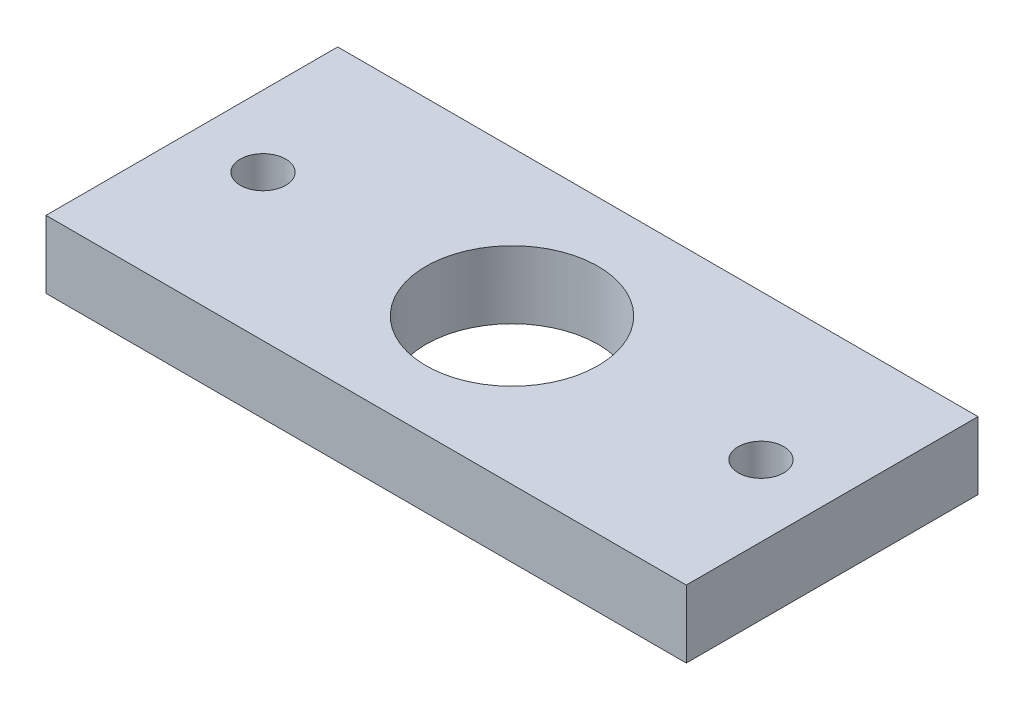
ISO-10303-21;
HEADER;
FILE_DESCRIPTION(('STEP AP214'),'2;1');
FILE_NAME('part.step','',(''),(''),'','','');
FILE_SCHEMA(('AUTOMOTIVE_DESIGN { 1 0 10303 214 1 1 1 1 }'));
ENDSEC;
DATA;
#1=APPLICATION_CONTEXT('core data for automotive mechanical design processes');
#2=APPLICATION_PROTOCOL_DEFINITION('international standard','automotive_design',2000,#1);
#3=PRODUCT_CONTEXT('',#1,'mechanical');
#4=PRODUCT('Part','Part','',(#3));
#5=PRODUCT_RELATED_PRODUCT_CATEGORY('part','',(#4));
#6=PRODUCT_DEFINITION_FORMATION('','',#4);
#7=PRODUCT_DEFINITION_CONTEXT('part definition',#1,'design');
#8=PRODUCT_DEFINITION('design','',#6,#7);
#9=PRODUCT_DEFINITION_SHAPE('','',#8);
#10=(LENGTH_UNIT() NAMED_UNIT(*) SI_UNIT(.MILLI.,.METRE.));
#11=(NAMED_UNIT(*) PLANE_ANGLE_UNIT() SI_UNIT($,.RADIAN.));
#12=(NAMED_UNIT(*) SI_UNIT($,.STERADIAN.) SOLID_ANGLE_UNIT());
#13=UNCERTAINTY_MEASURE_WITH_UNIT(LENGTH_MEASURE(1.E-05),#10,'distance_accuracy_value','');
#14=(GEOMETRIC_REPRESENTATION_CONTEXT(3) GLOBAL_UNCERTAINTY_ASSIGNED_CONTEXT((#13)) GLOBAL_UNIT_ASSIGNED_CONTEXT((#10,
#11,#12)) REPRESENTATION_CONTEXT('',''));
#15=CARTESIAN_POINT('',(0.,0.,0.));
#16=DIRECTION('',(0.,0.,1.));
#17=DIRECTION('',(1.,0.,0.));
#18=AXIS2_PLACEMENT_3D('',#15,#16,#17);
#19=CARTESIAN_POINT('',(0.,-2.375,0.));
#20=DIRECTION('',(0.,1.,0.));
#21=DIRECTION('',(1.,0.,0.));
#22=AXIS2_PLACEMENT_3D('',#19,#20,#21);
#23=PLANE('',#22);
#24=DIRECTION('',(-1.,0.,0.));
#25=VECTOR('',#24,1.);
#26=CARTESIAN_POINT('',(22.5,-2.375,-10.25));
#27=LINE('',#26,#25);
#28=CARTESIAN_POINT('',(22.5,-2.375,-10.25));
#29=VERTEX_POINT('',#28);
#30=CARTESIAN_POINT('',(-22.5,-2.375,-10.25));
#31=VERTEX_POINT('',#30);
#32=EDGE_CURVE('E80',#29,#31,#27,.T.);
#33=ORIENTED_EDGE('',*,*,#32,.F.);
#34=DIRECTION('',(0.,0.,-1.));
#35=VECTOR('',#34,1.);
#36=CARTESIAN_POINT('',(22.5,-2.375,10.25));
#37=LINE('',#36,#35);
#38=CARTESIAN_POINT('',(22.5,-2.375,10.25));
#39=VERTEX_POINT('',#38);
#40=EDGE_CURVE('E36',#39,#29,#37,.T.);
#41=ORIENTED_EDGE('',*,*,#40,.F.);
#42=DIRECTION('',(1.,0.,0.));
#43=VECTOR('',#42,1.);
#44=CARTESIAN_POINT('',(-22.5,-2.375,10.25));
#45=LINE('',#44,#43);
#46=CARTESIAN_POINT('',(-22.5,-2.375,10.25));
#47=VERTEX_POINT('',#46);
#48=EDGE_CURVE('E91',#47,#39,#45,.T.);
#49=ORIENTED_EDGE('',*,*,#48,.F.);
#50=DIRECTION('',(0.,0.,1.));
#51=VECTOR('',#50,1.);
#52=CARTESIAN_POINT('',(-22.5,-2.375,-10.25));
#53=LINE('',#52,#51);
#54=EDGE_CURVE('E82',#31,#47,#53,.T.);
#55=ORIENTED_EDGE('',*,*,#54,.F.);
#56=EDGE_LOOP('',(#33,#41,#49,#55));
#57=FACE_BOUND('',#56,.T.);
#58=CARTESIAN_POINT('',(0.,-2.375,0.));
#59=DIRECTION('',(0.,-1.,0.));
#60=DIRECTION('',(-1.,0.,0.));
#61=AXIS2_PLACEMENT_3D('',#58,#59,#60);
#62=CIRCLE('',#61,6.05);
#63=CARTESIAN_POINT('',(-6.05,-2.375,0.));
#64=VERTEX_POINT('',#63);
#65=EDGE_CURVE('E11',#64,#64,#62,.T.);
#66=ORIENTED_EDGE('',*,*,#65,.F.);
#67=EDGE_LOOP('',(#66));
#68=FACE_BOUND('',#67,.T.);
#69=CARTESIAN_POINT('',(17.5,-2.375,0.));
#70=DIRECTION('',(0.,-1.,0.));
#71=DIRECTION('',(-1.,0.,0.));
#72=AXIS2_PLACEMENT_3D('',#69,#70,#71);
#73=CIRCLE('',#72,1.6);
#74=CARTESIAN_POINT('',(15.9,-2.375,0.));
#75=VERTEX_POINT('',#74);
#76=EDGE_CURVE('E94',#75,#75,#73,.T.);
#77=ORIENTED_EDGE('',*,*,#76,.F.);
#78=EDGE_LOOP('',(#77));
#79=FACE_BOUND('',#78,.T.);
#80=CARTESIAN_POINT('',(-17.5,-2.375,0.));
#81=DIRECTION('',(0.,-1.,0.));
#82=DIRECTION('',(-1.,0.,0.));
#83=AXIS2_PLACEMENT_3D('',#80,#81,#82);
#84=CIRCLE('',#83,1.6);
#85=CARTESIAN_POINT('',(-19.1,-2.375,0.));
#86=VERTEX_POINT('',#85);
#87=EDGE_CURVE('E98',#86,#86,#84,.T.);
#88=ORIENTED_EDGE('',*,*,#87,.F.);
#89=EDGE_LOOP('',(#88));
#90=FACE_BOUND('',#89,.T.);
#91=ADVANCED_FACE('F17',(#57,#68,#79,#90),#23,.F.);
#92=CARTESIAN_POINT('',(0.,-2.375,0.));
#93=DIRECTION('',(0.,1.,0.));
#94=DIRECTION('',(1.,0.,0.));
#95=AXIS2_PLACEMENT_3D('',#92,#93,#94);
#96=CYLINDRICAL_SURFACE('',#95,6.05);
#97=CARTESIAN_POINT('',(0.,2.375,0.));
#98=DIRECTION('',(0.,-1.,0.));
#99=DIRECTION('',(1.,0.,0.));
#100=AXIS2_PLACEMENT_3D('',#97,#98,#99);
#101=CIRCLE('',#100,6.05);
#102=CARTESIAN_POINT('',(6.05,2.375,0.));
#103=VERTEX_POINT('',#102);
#104=EDGE_CURVE('E73',#103,#103,#101,.T.);
#105=ORIENTED_EDGE('',*,*,#104,.F.);
#106=EDGE_LOOP('',(#105));
#107=FACE_BOUND('',#106,.T.);
#108=ORIENTED_EDGE('',*,*,#65,.T.);
#109=EDGE_LOOP('',(#108));
#110=FACE_BOUND('',#109,.T.);
#111=ADVANCED_FACE('F119',(#107,#110),#96,.F.);
#112=CARTESIAN_POINT('',(0.,2.375,0.));
#113=DIRECTION('',(0.,1.,0.));
#114=DIRECTION('',(1.,0.,0.));
#115=AXIS2_PLACEMENT_3D('',#112,#113,#114);
#116=PLANE('',#115);
#117=DIRECTION('',(1.,0.,0.));
#118=VECTOR('',#117,1.);
#119=CARTESIAN_POINT('',(-22.5,2.375,10.25));
#120=LINE('',#119,#118);
#121=CARTESIAN_POINT('',(-22.5,2.375,10.25));
#122=VERTEX_POINT('',#121);
#123=CARTESIAN_POINT('',(22.5,2.375,10.25));
#124=VERTEX_POINT('',#123);
#125=EDGE_CURVE('E27',#122,#124,#120,.T.);
#126=ORIENTED_EDGE('',*,*,#125,.T.);
#127=DIRECTION('',(0.,0.,-1.));
#128=VECTOR('',#127,1.);
#129=CARTESIAN_POINT('',(22.5,2.375,10.25));
#130=LINE('',#129,#128);
#131=CARTESIAN_POINT('',(22.5,2.375,-10.25));
#132=VERTEX_POINT('',#131);
#133=EDGE_CURVE('E77',#124,#132,#130,.T.);
#134=ORIENTED_EDGE('',*,*,#133,.T.);
#135=DIRECTION('',(-1.,0.,0.));
#136=VECTOR('',#135,1.);
#137=CARTESIAN_POINT('',(22.5,2.375,-10.25));
#138=LINE('',#137,#136);
#139=CARTESIAN_POINT('',(-22.5,2.375,-10.25));
#140=VERTEX_POINT('',#139);
#141=EDGE_CURVE('E58',#132,#140,#138,.T.);
#142=ORIENTED_EDGE('',*,*,#141,.T.);
#143=DIRECTION('',(0.,0.,1.));
#144=VECTOR('',#143,1.);
#145=CARTESIAN_POINT('',(-22.5,2.375,-10.25));
#146=LINE('',#145,#144);
#147=EDGE_CURVE('E64',#140,#122,#146,.T.);
#148=ORIENTED_EDGE('',*,*,#147,.T.);
#149=EDGE_LOOP('',(#126,#134,#142,#148));
#150=FACE_BOUND('',#149,.T.);
#151=ORIENTED_EDGE('',*,*,#104,.T.);
#152=EDGE_LOOP('',(#151));
#153=FACE_BOUND('',#152,.T.);
#154=CARTESIAN_POINT('',(17.5,2.375,0.));
#155=DIRECTION('',(0.,-1.,0.));
#156=DIRECTION('',(-1.,0.,0.));
#157=AXIS2_PLACEMENT_3D('',#154,#155,#156);
#158=CIRCLE('',#157,1.6);
#159=CARTESIAN_POINT('',(15.9,2.375,0.));
#160=VERTEX_POINT('',#159);
#161=EDGE_CURVE('E103',#160,#160,#158,.T.);
#162=ORIENTED_EDGE('',*,*,#161,.T.);
#163=EDGE_LOOP('',(#162));
#164=FACE_BOUND('',#163,.T.);
#165=CARTESIAN_POINT('',(-17.5,2.375,0.));
#166=DIRECTION('',(0.,-1.,0.));
#167=DIRECTION('',(-1.,0.,0.));
#168=AXIS2_PLACEMENT_3D('',#165,#166,#167);
#169=CIRCLE('',#168,1.6);
#170=CARTESIAN_POINT('',(-19.1,2.375,0.));
#171=VERTEX_POINT('',#170);
#172=EDGE_CURVE('E97',#171,#171,#169,.T.);
#173=ORIENTED_EDGE('',*,*,#172,.T.);
#174=EDGE_LOOP('',(#173));
#175=FACE_BOUND('',#174,.T.);
#176=ADVANCED_FACE('F75',(#150,#153,#164,#175),#116,.T.);
#177=CARTESIAN_POINT('',(17.5,-2.375,0.));
#178=DIRECTION('',(0.,1.,0.));
#179=DIRECTION('',(1.,0.,0.));
#180=AXIS2_PLACEMENT_3D('',#177,#178,#179);
#181=CYLINDRICAL_SURFACE('',#180,1.6);
#182=ORIENTED_EDGE('',*,*,#161,.F.);
#183=EDGE_LOOP('',(#182));
#184=FACE_BOUND('',#183,.T.);
#185=ORIENTED_EDGE('',*,*,#76,.T.);
#186=EDGE_LOOP('',(#185));
#187=FACE_BOUND('',#186,.T.);
#188=ADVANCED_FACE('F114',(#184,#187),#181,.F.);
#189=CARTESIAN_POINT('',(-17.5,-2.375,0.));
#190=DIRECTION('',(0.,1.,0.));
#191=DIRECTION('',(1.,0.,0.));
#192=AXIS2_PLACEMENT_3D('',#189,#190,#191);
#193=CYLINDRICAL_SURFACE('',#192,1.6);
#194=ORIENTED_EDGE('',*,*,#172,.F.);
#195=EDGE_LOOP('',(#194));
#196=FACE_BOUND('',#195,.T.);
#197=ORIENTED_EDGE('',*,*,#87,.T.);
#198=EDGE_LOOP('',(#197));
#199=FACE_BOUND('',#198,.T.);
#200=ADVANCED_FACE('F111',(#196,#199),#193,.F.);
#201=CARTESIAN_POINT('',(-22.5,-2.375,-10.25));
#202=DIRECTION('',(-1.,0.,0.));
#203=DIRECTION('',(0.,0.,1.));
#204=AXIS2_PLACEMENT_3D('',#201,#202,#203);
#205=PLANE('',#204);
#206=DIRECTION('',(0.,1.,0.));
#207=VECTOR('',#206,1.);
#208=CARTESIAN_POINT('',(-22.5,-2.375,10.25));
#209=LINE('',#208,#207);
#210=EDGE_CURVE('E69',#47,#122,#209,.T.);
#211=ORIENTED_EDGE('',*,*,#210,.T.);
#212=ORIENTED_EDGE('',*,*,#147,.F.);
#213=DIRECTION('',(0.,1.,0.));
#214=VECTOR('',#213,1.);
#215=CARTESIAN_POINT('',(-22.5,-2.375,-10.25));
#216=LINE('',#215,#214);
#217=EDGE_CURVE('E67',#31,#140,#216,.T.);
#218=ORIENTED_EDGE('',*,*,#217,.F.);
#219=ORIENTED_EDGE('',*,*,#54,.T.);
#220=EDGE_LOOP('',(#211,#212,#218,#219));
#221=FACE_BOUND('',#220,.T.);
#222=ADVANCED_FACE('F65',(#221),#205,.T.);
#223=CARTESIAN_POINT('',(22.5,-2.375,-10.25));
#224=DIRECTION('',(0.,0.,-1.));
#225=DIRECTION('',(-1.,0.,0.));
#226=AXIS2_PLACEMENT_3D('',#223,#224,#225);
#227=PLANE('',#226);
#228=ORIENTED_EDGE('',*,*,#217,.T.);
#229=ORIENTED_EDGE('',*,*,#141,.F.);
#230=DIRECTION('',(0.,1.,0.));
#231=VECTOR('',#230,1.);
#232=CARTESIAN_POINT('',(22.5,-2.375,-10.25));
#233=LINE('',#232,#231);
#234=EDGE_CURVE('E85',#29,#132,#233,.T.);
#235=ORIENTED_EDGE('',*,*,#234,.F.);
#236=ORIENTED_EDGE('',*,*,#32,.T.);
#237=EDGE_LOOP('',(#228,#229,#235,#236));
#238=FACE_BOUND('',#237,.T.);
#239=ADVANCED_FACE('F79',(#238),#227,.T.);
#240=CARTESIAN_POINT('',(22.5,-2.375,10.25));
#241=DIRECTION('',(1.,0.,0.));
#242=DIRECTION('',(0.,0.,-1.));
#243=AXIS2_PLACEMENT_3D('',#240,#241,#242);
#244=PLANE('',#243);
#245=ORIENTED_EDGE('',*,*,#234,.T.);
#246=ORIENTED_EDGE('',*,*,#133,.F.);
#247=DIRECTION('',(0.,1.,0.));
#248=VECTOR('',#247,1.);
#249=CARTESIAN_POINT('',(22.5,-2.375,10.25));
#250=LINE('',#249,#248);
#251=EDGE_CURVE('E21',#39,#124,#250,.T.);
#252=ORIENTED_EDGE('',*,*,#251,.F.);
#253=ORIENTED_EDGE('',*,*,#40,.T.);
#254=EDGE_LOOP('',(#245,#246,#252,#253));
#255=FACE_BOUND('',#254,.T.);
#256=ADVANCED_FACE('F138',(#255),#244,.T.);
#257=CARTESIAN_POINT('',(-22.5,-2.375,10.25));
#258=DIRECTION('',(0.,0.,1.));
#259=DIRECTION('',(1.,0.,0.));
#260=AXIS2_PLACEMENT_3D('',#257,#258,#259);
#261=PLANE('',#260);
#262=ORIENTED_EDGE('',*,*,#251,.T.);
#263=ORIENTED_EDGE('',*,*,#125,.F.);
#264=ORIENTED_EDGE('',*,*,#210,.F.);
#265=ORIENTED_EDGE('',*,*,#48,.T.);
#266=EDGE_LOOP('',(#262,#263,#264,#265));
#267=FACE_BOUND('',#266,.T.);
#268=ADVANCED_FACE('F19',(#267),#261,.T.);
#269=CLOSED_SHELL('',(#91,#111,#176,#188,#200,#222,#239,#256,#268));
#270=MANIFOLD_SOLID_BREP('B1',#269);
#271=ADVANCED_BREP_SHAPE_REPRESENTATION('',(#18,#270),#14);
#272=SHAPE_DEFINITION_REPRESENTATION(#9,#271);
ENDSEC;
END-ISO-10303-21;
